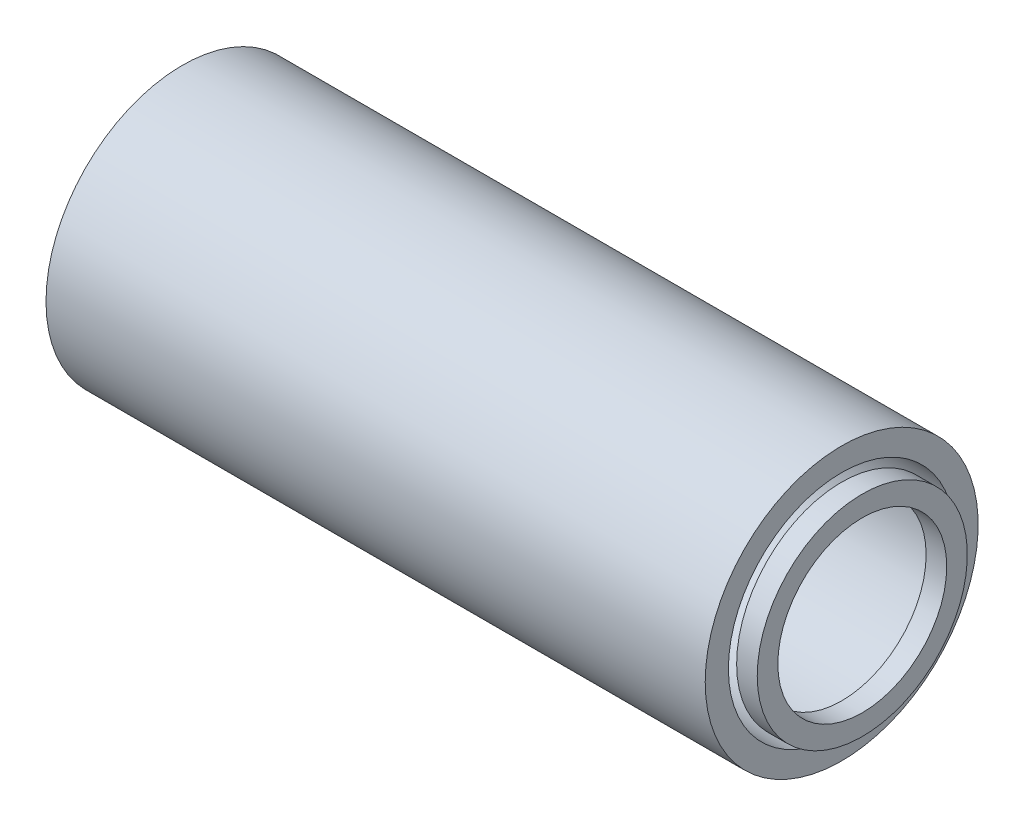
ISO-10303-21;
HEADER;
FILE_DESCRIPTION(('STEP AP214'),'2;1');
FILE_NAME('part.step','',(''),(''),'','','');
FILE_SCHEMA(('AUTOMOTIVE_DESIGN { 1 0 10303 214 1 1 1 1 }'));
ENDSEC;
DATA;
#1=APPLICATION_CONTEXT('core data for automotive mechanical design processes');
#2=APPLICATION_PROTOCOL_DEFINITION('international standard','automotive_design',2000,#1);
#3=PRODUCT_CONTEXT('',#1,'mechanical');
#4=PRODUCT('Part','Part','',(#3));
#5=PRODUCT_RELATED_PRODUCT_CATEGORY('part','',(#4));
#6=PRODUCT_DEFINITION_FORMATION('','',#4);
#7=PRODUCT_DEFINITION_CONTEXT('part definition',#1,'design');
#8=PRODUCT_DEFINITION('design','',#6,#7);
#9=PRODUCT_DEFINITION_SHAPE('','',#8);
#10=(LENGTH_UNIT() NAMED_UNIT(*) SI_UNIT(.MILLI.,.METRE.));
#11=(NAMED_UNIT(*) PLANE_ANGLE_UNIT() SI_UNIT($,.RADIAN.));
#12=(NAMED_UNIT(*) SI_UNIT($,.STERADIAN.) SOLID_ANGLE_UNIT());
#13=UNCERTAINTY_MEASURE_WITH_UNIT(LENGTH_MEASURE(1.E-05),#10,'distance_accuracy_value','');
#14=(GEOMETRIC_REPRESENTATION_CONTEXT(3) GLOBAL_UNCERTAINTY_ASSIGNED_CONTEXT((#13)) GLOBAL_UNIT_ASSIGNED_CONTEXT((#10,
#11,#12)) REPRESENTATION_CONTEXT('',''));
#15=CARTESIAN_POINT('',(0.,0.,0.));
#16=DIRECTION('',(0.,0.,1.));
#17=DIRECTION('',(1.,0.,0.));
#18=AXIS2_PLACEMENT_3D('',#15,#16,#17);
#19=CARTESIAN_POINT('',(-50.8,0.,0.));
#20=DIRECTION('',(1.,0.,0.));
#21=DIRECTION('',(0.,0.,1.));
#22=AXIS2_PLACEMENT_3D('',#19,#20,#21);
#23=CYLINDRICAL_SURFACE('',#22,13.0175);
#24=CARTESIAN_POINT('',(-53.975,0.,0.));
#25=DIRECTION('',(-1.,0.,0.));
#26=DIRECTION('',(0.,0.,1.));
#27=AXIS2_PLACEMENT_3D('',#24,#25,#26);
#28=CIRCLE('',#27,13.0175);
#29=CARTESIAN_POINT('',(-53.975,0.,13.0175));
#30=VERTEX_POINT('',#29);
#31=EDGE_CURVE('E11',#30,#30,#28,.T.);
#32=ORIENTED_EDGE('',*,*,#31,.T.);
#33=EDGE_LOOP('',(#32));
#34=FACE_BOUND('',#33,.T.);
#35=CARTESIAN_POINT('',(-50.8,0.,0.));
#36=DIRECTION('',(-1.,0.,0.));
#37=DIRECTION('',(0.,0.,1.));
#38=AXIS2_PLACEMENT_3D('',#35,#36,#37);
#39=CIRCLE('',#38,13.0175);
#40=CARTESIAN_POINT('',(-50.8,0.,13.0175));
#41=VERTEX_POINT('',#40);
#42=EDGE_CURVE('E57',#41,#41,#39,.T.);
#43=ORIENTED_EDGE('',*,*,#42,.F.);
#44=EDGE_LOOP('',(#43));
#45=FACE_BOUND('',#44,.T.);
#46=ADVANCED_FACE('F43',(#34,#45),#23,.F.);
#47=CARTESIAN_POINT('',(-53.975,1.17961196366423E-13,0.));
#48=DIRECTION('',(1.,0.,0.));
#49=DIRECTION('',(0.,0.,1.));
#50=AXIS2_PLACEMENT_3D('',#47,#48,#49);
#51=PLANE('',#50);
#52=CARTESIAN_POINT('',(-53.975,0.,0.));
#53=DIRECTION('',(-1.,0.,0.));
#54=DIRECTION('',(0.,0.,1.));
#55=AXIS2_PLACEMENT_3D('',#52,#53,#54);
#56=CIRCLE('',#55,16.1925);
#57=CARTESIAN_POINT('',(-53.975,0.,16.1925));
#58=VERTEX_POINT('',#57);
#59=EDGE_CURVE('E49',#58,#58,#56,.T.);
#60=ORIENTED_EDGE('',*,*,#59,.T.);
#61=EDGE_LOOP('',(#60));
#62=FACE_BOUND('',#61,.T.);
#63=ORIENTED_EDGE('',*,*,#31,.F.);
#64=EDGE_LOOP('',(#63));
#65=FACE_BOUND('',#64,.T.);
#66=ADVANCED_FACE('F67',(#62,#65),#51,.F.);
#67=CARTESIAN_POINT('',(-50.8,0.,0.));
#68=DIRECTION('',(1.,0.,0.));
#69=DIRECTION('',(0.,0.,1.));
#70=AXIS2_PLACEMENT_3D('',#67,#68,#69);
#71=CYLINDRICAL_SURFACE('',#70,16.1925);
#72=CARTESIAN_POINT('',(-50.8,0.,0.));
#73=DIRECTION('',(-1.,0.,0.));
#74=DIRECTION('',(0.,0.,1.));
#75=AXIS2_PLACEMENT_3D('',#72,#73,#74);
#76=CIRCLE('',#75,16.1925);
#77=CARTESIAN_POINT('',(-50.8,0.,16.1925));
#78=VERTEX_POINT('',#77);
#79=EDGE_CURVE('E53',#78,#78,#76,.T.);
#80=ORIENTED_EDGE('',*,*,#79,.T.);
#81=EDGE_LOOP('',(#80));
#82=FACE_BOUND('',#81,.T.);
#83=ORIENTED_EDGE('',*,*,#59,.F.);
#84=EDGE_LOOP('',(#83));
#85=FACE_BOUND('',#84,.T.);
#86=ADVANCED_FACE('F71',(#82,#85),#71,.T.);
#87=CARTESIAN_POINT('',(-50.8,0.,0.));
#88=DIRECTION('',(-1.,0.,0.));
#89=DIRECTION('',(0.,0.,-1.));
#90=AXIS2_PLACEMENT_3D('',#87,#88,#89);
#91=PLANE('',#90);
#92=ORIENTED_EDGE('',*,*,#42,.T.);
#93=EDGE_LOOP('',(#92));
#94=FACE_BOUND('',#93,.T.);
#95=ORIENTED_EDGE('',*,*,#79,.F.);
#96=EDGE_LOOP('',(#95));
#97=FACE_BOUND('',#96,.T.);
#98=ADVANCED_FACE('F63',(#94,#97),#91,.F.);
#99=CLOSED_SHELL('',(#46,#66,#86,#98));
#100=MANIFOLD_SOLID_BREP('B2',#99);
#101=CARTESIAN_POINT('',(50.8,0.,0.));
#102=DIRECTION('',(-1.,0.,0.));
#103=DIRECTION('',(0.,0.,1.));
#104=AXIS2_PLACEMENT_3D('',#101,#102,#103);
#105=CYLINDRICAL_SURFACE('',#104,13.0175);
#106=CARTESIAN_POINT('',(53.975,0.,0.));
#107=DIRECTION('',(-1.,0.,0.));
#108=DIRECTION('',(0.,0.,1.));
#109=AXIS2_PLACEMENT_3D('',#106,#107,#108);
#110=CIRCLE('',#109,13.0175);
#111=CARTESIAN_POINT('',(53.975,0.,13.0175));
#112=VERTEX_POINT('',#111);
#113=EDGE_CURVE('E42',#112,#112,#110,.T.);
#114=ORIENTED_EDGE('',*,*,#113,.F.);
#115=EDGE_LOOP('',(#114));
#116=FACE_BOUND('',#115,.T.);
#117=CARTESIAN_POINT('',(50.8,0.,0.));
#118=DIRECTION('',(-1.,0.,0.));
#119=DIRECTION('',(0.,0.,1.));
#120=AXIS2_PLACEMENT_3D('',#117,#118,#119);
#121=CIRCLE('',#120,13.0175);
#122=CARTESIAN_POINT('',(50.8,0.,13.0175));
#123=VERTEX_POINT('',#122);
#124=EDGE_CURVE('E146',#123,#123,#121,.T.);
#125=ORIENTED_EDGE('',*,*,#124,.T.);
#126=EDGE_LOOP('',(#125));
#127=FACE_BOUND('',#126,.T.);
#128=ADVANCED_FACE('F132',(#116,#127),#105,.F.);
#129=CARTESIAN_POINT('',(53.975,1.17961196366423E-13,0.));
#130=DIRECTION('',(-1.,0.,0.));
#131=DIRECTION('',(0.,0.,1.));
#132=AXIS2_PLACEMENT_3D('',#129,#130,#131);
#133=PLANE('',#132);
#134=CARTESIAN_POINT('',(53.975,0.,0.));
#135=DIRECTION('',(-1.,0.,0.));
#136=DIRECTION('',(0.,0.,1.));
#137=AXIS2_PLACEMENT_3D('',#134,#135,#136);
#138=CIRCLE('',#137,16.1925);
#139=CARTESIAN_POINT('',(53.975,0.,16.1925));
#140=VERTEX_POINT('',#139);
#141=EDGE_CURVE('E138',#140,#140,#138,.T.);
#142=ORIENTED_EDGE('',*,*,#141,.F.);
#143=EDGE_LOOP('',(#142));
#144=FACE_BOUND('',#143,.T.);
#145=ORIENTED_EDGE('',*,*,#113,.T.);
#146=EDGE_LOOP('',(#145));
#147=FACE_BOUND('',#146,.T.);
#148=ADVANCED_FACE('F161',(#144,#147),#133,.F.);
#149=CARTESIAN_POINT('',(50.8,0.,0.));
#150=DIRECTION('',(-1.,0.,0.));
#151=DIRECTION('',(0.,0.,1.));
#152=AXIS2_PLACEMENT_3D('',#149,#150,#151);
#153=CYLINDRICAL_SURFACE('',#152,16.1925);
#154=CARTESIAN_POINT('',(50.8,0.,0.));
#155=DIRECTION('',(-1.,0.,0.));
#156=DIRECTION('',(0.,0.,1.));
#157=AXIS2_PLACEMENT_3D('',#154,#155,#156);
#158=CIRCLE('',#157,16.1925);
#159=CARTESIAN_POINT('',(50.8,0.,16.1925));
#160=VERTEX_POINT('',#159);
#161=EDGE_CURVE('E142',#160,#160,#158,.T.);
#162=ORIENTED_EDGE('',*,*,#161,.F.);
#163=EDGE_LOOP('',(#162));
#164=FACE_BOUND('',#163,.T.);
#165=ORIENTED_EDGE('',*,*,#141,.T.);
#166=EDGE_LOOP('',(#165));
#167=FACE_BOUND('',#166,.T.);
#168=ADVANCED_FACE('F156',(#164,#167),#153,.T.);
#169=CARTESIAN_POINT('',(50.8,0.,0.));
#170=DIRECTION('',(1.,0.,0.));
#171=DIRECTION('',(0.,0.,-1.));
#172=AXIS2_PLACEMENT_3D('',#169,#170,#171);
#173=PLANE('',#172);
#174=ORIENTED_EDGE('',*,*,#124,.F.);
#175=EDGE_LOOP('',(#174));
#176=FACE_BOUND('',#175,.T.);
#177=ORIENTED_EDGE('',*,*,#161,.T.);
#178=EDGE_LOOP('',(#177));
#179=FACE_BOUND('',#178,.T.);
#180=ADVANCED_FACE('F153',(#176,#179),#173,.F.);
#181=CLOSED_SHELL('',(#128,#148,#168,#180));
#182=MANIFOLD_SOLID_BREP('B6',#181);
#183=CARTESIAN_POINT('',(-50.8,17.4625,0.));
#184=DIRECTION('',(1.,0.,0.));
#185=DIRECTION('',(0.,0.,-1.));
#186=AXIS2_PLACEMENT_3D('',#183,#184,#185);
#187=PLANE('',#186);
#188=CARTESIAN_POINT('',(-50.8,0.,0.));
#189=DIRECTION('',(-1.,0.,0.));
#190=DIRECTION('',(0.,0.,1.));
#191=AXIS2_PLACEMENT_3D('',#188,#189,#190);
#192=CIRCLE('',#191,17.4625);
#193=CARTESIAN_POINT('',(-50.8,0.,17.4625));
#194=VERTEX_POINT('',#193);
#195=EDGE_CURVE('E207',#194,#194,#192,.T.);
#196=ORIENTED_EDGE('',*,*,#195,.F.);
#197=EDGE_LOOP('',(#196));
#198=FACE_BOUND('',#197,.T.);
#199=CARTESIAN_POINT('',(-50.8,0.,0.));
#200=DIRECTION('',(-1.,0.,0.));
#201=DIRECTION('',(0.,0.,1.));
#202=AXIS2_PLACEMENT_3D('',#199,#200,#201);
#203=CIRCLE('',#202,21.034375);
#204=CARTESIAN_POINT('',(-50.8,0.,21.034375));
#205=VERTEX_POINT('',#204);
#206=EDGE_CURVE('E131',#205,#205,#203,.T.);
#207=ORIENTED_EDGE('',*,*,#206,.T.);
#208=EDGE_LOOP('',(#207));
#209=FACE_BOUND('',#208,.T.);
#210=ADVANCED_FACE('F193',(#198,#209),#187,.F.);
#211=CARTESIAN_POINT('',(-50.8,0.,0.));
#212=DIRECTION('',(-1.,0.,0.));
#213=DIRECTION('',(0.,0.,1.));
#214=AXIS2_PLACEMENT_3D('',#211,#212,#213);
#215=CYLINDRICAL_SURFACE('',#214,21.034375);
#216=ORIENTED_EDGE('',*,*,#206,.F.);
#217=EDGE_LOOP('',(#216));
#218=FACE_BOUND('',#217,.T.);
#219=CARTESIAN_POINT('',(50.8,0.,0.));
#220=DIRECTION('',(-1.,0.,0.));
#221=DIRECTION('',(0.,0.,1.));
#222=AXIS2_PLACEMENT_3D('',#219,#220,#221);
#223=CIRCLE('',#222,21.034375);
#224=CARTESIAN_POINT('',(50.8,0.,21.034375));
#225=VERTEX_POINT('',#224);
#226=EDGE_CURVE('E199',#225,#225,#223,.T.);
#227=ORIENTED_EDGE('',*,*,#226,.T.);
#228=EDGE_LOOP('',(#227));
#229=FACE_BOUND('',#228,.T.);
#230=ADVANCED_FACE('F216',(#218,#229),#215,.T.);
#231=CARTESIAN_POINT('',(50.8,17.4625,0.));
#232=DIRECTION('',(-1.,0.,0.));
#233=DIRECTION('',(0.,0.,1.));
#234=AXIS2_PLACEMENT_3D('',#231,#232,#233);
#235=PLANE('',#234);
#236=ORIENTED_EDGE('',*,*,#226,.F.);
#237=EDGE_LOOP('',(#236));
#238=FACE_BOUND('',#237,.T.);
#239=CARTESIAN_POINT('',(50.8,0.,0.));
#240=DIRECTION('',(-1.,0.,0.));
#241=DIRECTION('',(0.,0.,1.));
#242=AXIS2_PLACEMENT_3D('',#239,#240,#241);
#243=CIRCLE('',#242,17.4625);
#244=CARTESIAN_POINT('',(50.8,0.,17.4625));
#245=VERTEX_POINT('',#244);
#246=EDGE_CURVE('E203',#245,#245,#243,.T.);
#247=ORIENTED_EDGE('',*,*,#246,.T.);
#248=EDGE_LOOP('',(#247));
#249=FACE_BOUND('',#248,.T.);
#250=ADVANCED_FACE('F220',(#238,#249),#235,.F.);
#251=CARTESIAN_POINT('',(-50.8,0.,0.));
#252=DIRECTION('',(-1.,0.,0.));
#253=DIRECTION('',(0.,0.,1.));
#254=AXIS2_PLACEMENT_3D('',#251,#252,#253);
#255=CYLINDRICAL_SURFACE('',#254,17.4625);
#256=ORIENTED_EDGE('',*,*,#246,.F.);
#257=EDGE_LOOP('',(#256));
#258=FACE_BOUND('',#257,.T.);
#259=ORIENTED_EDGE('',*,*,#195,.T.);
#260=EDGE_LOOP('',(#259));
#261=FACE_BOUND('',#260,.T.);
#262=ADVANCED_FACE('F213',(#258,#261),#255,.F.);
#263=CLOSED_SHELL('',(#210,#230,#250,#262));
#264=MANIFOLD_SOLID_BREP('B37',#263);
#265=ADVANCED_BREP_SHAPE_REPRESENTATION('',(#18,#100,#182,#264),#14);
#266=SHAPE_DEFINITION_REPRESENTATION(#9,#265);
ENDSEC;
END-ISO-10303-21;
